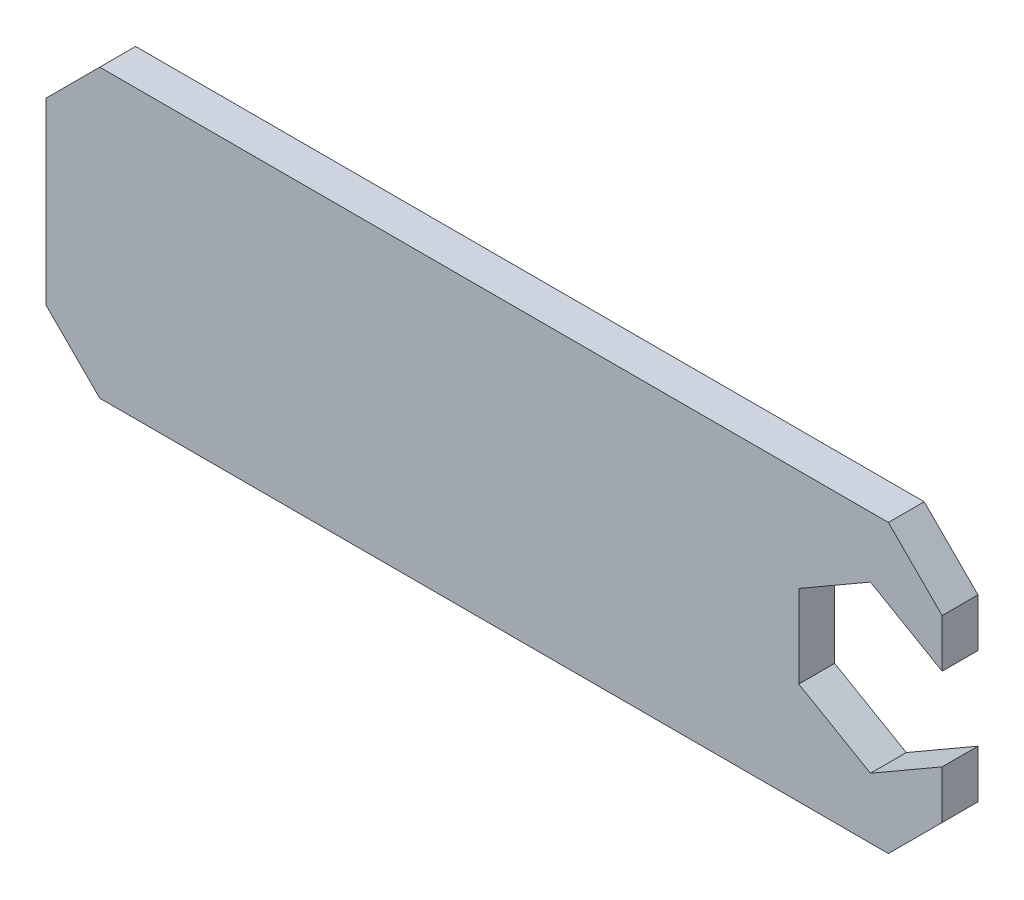
ISO-10303-21;
HEADER;
FILE_DESCRIPTION(('STEP AP214'),'2;1');
FILE_NAME('part.step','',(''),(''),'','','');
FILE_SCHEMA(('AUTOMOTIVE_DESIGN { 1 0 10303 214 1 1 1 1 }'));
ENDSEC;
DATA;
#1=APPLICATION_CONTEXT('core data for automotive mechanical design processes');
#2=APPLICATION_PROTOCOL_DEFINITION('international standard','automotive_design',2000,#1);
#3=PRODUCT_CONTEXT('',#1,'mechanical');
#4=PRODUCT('Part','Part','',(#3));
#5=PRODUCT_RELATED_PRODUCT_CATEGORY('part','',(#4));
#6=PRODUCT_DEFINITION_FORMATION('','',#4);
#7=PRODUCT_DEFINITION_CONTEXT('part definition',#1,'design');
#8=PRODUCT_DEFINITION('design','',#6,#7);
#9=PRODUCT_DEFINITION_SHAPE('','',#8);
#10=(LENGTH_UNIT() NAMED_UNIT(*) SI_UNIT(.MILLI.,.METRE.));
#11=(NAMED_UNIT(*) PLANE_ANGLE_UNIT() SI_UNIT($,.RADIAN.));
#12=(NAMED_UNIT(*) SI_UNIT($,.STERADIAN.) SOLID_ANGLE_UNIT());
#13=UNCERTAINTY_MEASURE_WITH_UNIT(LENGTH_MEASURE(1.E-05),#10,'distance_accuracy_value','');
#14=(GEOMETRIC_REPRESENTATION_CONTEXT(3) GLOBAL_UNCERTAINTY_ASSIGNED_CONTEXT((#13)) GLOBAL_UNIT_ASSIGNED_CONTEXT((#10,
#11,#12)) REPRESENTATION_CONTEXT('',''));
#15=CARTESIAN_POINT('',(0.,0.,0.));
#16=DIRECTION('',(0.,0.,1.));
#17=DIRECTION('',(1.,0.,0.));
#18=AXIS2_PLACEMENT_3D('',#15,#16,#17);
#19=CARTESIAN_POINT('',(50.,0.,2.));
#20=DIRECTION('',(-1.,0.,0.));
#21=DIRECTION('',(0.,0.,1.));
#22=AXIS2_PLACEMENT_3D('',#19,#20,#21);
#23=PLANE('',#22);
#24=DIRECTION('',(0.,1.,0.));
#25=VECTOR('',#24,1.);
#26=CARTESIAN_POINT('',(50.,0.,2.));
#27=LINE('',#26,#25);
#28=CARTESIAN_POINT('',(50.,10.3094010767585,2.));
#29=VERTEX_POINT('',#28);
#30=CARTESIAN_POINT('',(50.,13.,2.));
#31=VERTEX_POINT('',#30);
#32=EDGE_CURVE('E104',#29,#31,#27,.T.);
#33=ORIENTED_EDGE('',*,*,#32,.F.);
#34=DIRECTION('',(0.,0.,1.));
#35=VECTOR('',#34,1.);
#36=CARTESIAN_POINT('',(50.,10.3094010767585,-8.));
#37=LINE('',#36,#35);
#38=CARTESIAN_POINT('',(50.,10.3094010767585,0.));
#39=VERTEX_POINT('',#38);
#40=EDGE_CURVE('E231',#39,#29,#37,.T.);
#41=ORIENTED_EDGE('',*,*,#40,.F.);
#42=DIRECTION('',(0.,1.,0.));
#43=VECTOR('',#42,1.);
#44=CARTESIAN_POINT('',(50.,0.,0.));
#45=LINE('',#44,#43);
#46=CARTESIAN_POINT('',(50.,13.,0.));
#47=VERTEX_POINT('',#46);
#48=EDGE_CURVE('E152',#39,#47,#45,.T.);
#49=ORIENTED_EDGE('',*,*,#48,.T.);
#50=DIRECTION('',(0.,0.,-1.));
#51=VECTOR('',#50,1.);
#52=CARTESIAN_POINT('',(50.,13.,2.));
#53=LINE('',#52,#51);
#54=EDGE_CURVE('E177',#31,#47,#53,.T.);
#55=ORIENTED_EDGE('',*,*,#54,.F.);
#56=EDGE_LOOP('',(#33,#41,#49,#55));
#57=FACE_BOUND('',#56,.T.);
#58=ADVANCED_FACE('F39',(#57),#23,.F.);
#59=CARTESIAN_POINT('',(50.,3.00000000000001,0.));
#60=VERTEX_POINT('',#59);
#61=CARTESIAN_POINT('',(50.,5.6905989232415,0.));
#62=VERTEX_POINT('',#61);
#63=EDGE_CURVE('E148',#60,#62,#45,.T.);
#64=ORIENTED_EDGE('',*,*,#63,.T.);
#65=DIRECTION('',(0.,0.,1.));
#66=VECTOR('',#65,1.);
#67=CARTESIAN_POINT('',(50.,5.6905989232415,-8.));
#68=LINE('',#67,#66);
#69=CARTESIAN_POINT('',(50.,5.6905989232415,2.));
#70=VERTEX_POINT('',#69);
#71=EDGE_CURVE('E205',#62,#70,#68,.T.);
#72=ORIENTED_EDGE('',*,*,#71,.T.);
#73=CARTESIAN_POINT('',(50.,3.00000000000001,2.));
#74=VERTEX_POINT('',#73);
#75=EDGE_CURVE('E206',#74,#70,#27,.T.);
#76=ORIENTED_EDGE('',*,*,#75,.F.);
#77=DIRECTION('',(0.,0.,-1.));
#78=VECTOR('',#77,1.);
#79=CARTESIAN_POINT('',(50.,3.00000000000001,2.));
#80=LINE('',#79,#78);
#81=EDGE_CURVE('E144',#74,#60,#80,.T.);
#82=ORIENTED_EDGE('',*,*,#81,.T.);
#83=EDGE_LOOP('',(#64,#72,#76,#82));
#84=FACE_BOUND('',#83,.T.);
#85=ADVANCED_FACE('F41',(#84),#23,.F.);
#86=CARTESIAN_POINT('',(31.5,31.5,2.));
#87=DIRECTION('',(-0.707106781186547,-0.707106781186548,0.));
#88=DIRECTION('',(0.707106781186548,-0.707106781186547,0.));
#89=AXIS2_PLACEMENT_3D('',#86,#87,#88);
#90=PLANE('',#89);
#91=DIRECTION('',(-0.707106781186548,0.707106781186547,0.));
#92=VECTOR('',#91,1.);
#93=CARTESIAN_POINT('',(31.5,31.5,0.));
#94=LINE('',#93,#92);
#95=CARTESIAN_POINT('',(47.,16.,0.));
#96=VERTEX_POINT('',#95);
#97=EDGE_CURVE('E151',#47,#96,#94,.T.);
#98=ORIENTED_EDGE('',*,*,#97,.T.);
#99=DIRECTION('',(0.,0.,-1.));
#100=VECTOR('',#99,1.);
#101=CARTESIAN_POINT('',(47.,16.,2.));
#102=LINE('',#101,#100);
#103=CARTESIAN_POINT('',(47.,16.,2.));
#104=VERTEX_POINT('',#103);
#105=EDGE_CURVE('E175',#104,#96,#102,.T.);
#106=ORIENTED_EDGE('',*,*,#105,.F.);
#107=DIRECTION('',(-0.707106781186548,0.707106781186547,0.));
#108=VECTOR('',#107,1.);
#109=CARTESIAN_POINT('',(31.5,31.5,2.));
#110=LINE('',#109,#108);
#111=EDGE_CURVE('E226',#31,#104,#110,.T.);
#112=ORIENTED_EDGE('',*,*,#111,.F.);
#113=ORIENTED_EDGE('',*,*,#54,.T.);
#114=EDGE_LOOP('',(#98,#106,#112,#113));
#115=FACE_BOUND('',#114,.T.);
#116=ADVANCED_FACE('F224',(#115),#90,.F.);
#117=CARTESIAN_POINT('',(0.,16.,2.));
#118=DIRECTION('',(0.,1.,0.));
#119=DIRECTION('',(0.,0.,1.));
#120=AXIS2_PLACEMENT_3D('',#117,#118,#119);
#121=PLANE('',#120);
#122=DIRECTION('',(1.,0.,0.));
#123=VECTOR('',#122,1.);
#124=CARTESIAN_POINT('',(0.,16.,0.));
#125=LINE('',#124,#123);
#126=CARTESIAN_POINT('',(3.,16.,0.));
#127=VERTEX_POINT('',#126);
#128=EDGE_CURVE('E155',#127,#96,#125,.T.);
#129=ORIENTED_EDGE('',*,*,#128,.F.);
#130=DIRECTION('',(0.,0.,-1.));
#131=VECTOR('',#130,1.);
#132=CARTESIAN_POINT('',(3.,16.,2.));
#133=LINE('',#132,#131);
#134=CARTESIAN_POINT('',(3.,16.,2.));
#135=VERTEX_POINT('',#134);
#136=EDGE_CURVE('E173',#135,#127,#133,.T.);
#137=ORIENTED_EDGE('',*,*,#136,.F.);
#138=DIRECTION('',(1.,0.,0.));
#139=VECTOR('',#138,1.);
#140=CARTESIAN_POINT('',(0.,16.,2.));
#141=LINE('',#140,#139);
#142=EDGE_CURVE('E222',#135,#104,#141,.T.);
#143=ORIENTED_EDGE('',*,*,#142,.T.);
#144=ORIENTED_EDGE('',*,*,#105,.T.);
#145=EDGE_LOOP('',(#129,#137,#143,#144));
#146=FACE_BOUND('',#145,.T.);
#147=ADVANCED_FACE('F218',(#146),#121,.T.);
#148=CARTESIAN_POINT('',(-6.5,6.5,2.));
#149=DIRECTION('',(-0.707106781186547,0.707106781186548,0.));
#150=DIRECTION('',(-0.707106781186548,-0.707106781186547,0.));
#151=AXIS2_PLACEMENT_3D('',#148,#149,#150);
#152=PLANE('',#151);
#153=DIRECTION('',(0.707106781186548,0.707106781186547,0.));
#154=VECTOR('',#153,1.);
#155=CARTESIAN_POINT('',(-6.5,6.5,0.));
#156=LINE('',#155,#154);
#157=CARTESIAN_POINT('',(0.,13.,0.));
#158=VERTEX_POINT('',#157);
#159=EDGE_CURVE('E158',#158,#127,#156,.T.);
#160=ORIENTED_EDGE('',*,*,#159,.F.);
#161=DIRECTION('',(0.,0.,-1.));
#162=VECTOR('',#161,1.);
#163=CARTESIAN_POINT('',(0.,13.,2.));
#164=LINE('',#163,#162);
#165=CARTESIAN_POINT('',(0.,13.,2.));
#166=VERTEX_POINT('',#165);
#167=EDGE_CURVE('E171',#166,#158,#164,.T.);
#168=ORIENTED_EDGE('',*,*,#167,.F.);
#169=DIRECTION('',(0.707106781186548,0.707106781186547,0.));
#170=VECTOR('',#169,1.);
#171=CARTESIAN_POINT('',(-6.5,6.5,2.));
#172=LINE('',#171,#170);
#173=EDGE_CURVE('E253',#166,#135,#172,.T.);
#174=ORIENTED_EDGE('',*,*,#173,.T.);
#175=ORIENTED_EDGE('',*,*,#136,.T.);
#176=EDGE_LOOP('',(#160,#168,#174,#175));
#177=FACE_BOUND('',#176,.T.);
#178=ADVANCED_FACE('F214',(#177),#152,.T.);
#179=CARTESIAN_POINT('',(0.,0.,2.));
#180=DIRECTION('',(-1.,0.,0.));
#181=DIRECTION('',(0.,0.,1.));
#182=AXIS2_PLACEMENT_3D('',#179,#180,#181);
#183=PLANE('',#182);
#184=DIRECTION('',(0.,1.,0.));
#185=VECTOR('',#184,1.);
#186=CARTESIAN_POINT('',(0.,0.,0.));
#187=LINE('',#186,#185);
#188=CARTESIAN_POINT('',(0.,3.,0.));
#189=VERTEX_POINT('',#188);
#190=EDGE_CURVE('E161',#189,#158,#187,.T.);
#191=ORIENTED_EDGE('',*,*,#190,.F.);
#192=DIRECTION('',(0.,0.,-1.));
#193=VECTOR('',#192,1.);
#194=CARTESIAN_POINT('',(0.,3.,2.));
#195=LINE('',#194,#193);
#196=CARTESIAN_POINT('',(0.,3.,2.));
#197=VERTEX_POINT('',#196);
#198=EDGE_CURVE('E139',#197,#189,#195,.T.);
#199=ORIENTED_EDGE('',*,*,#198,.F.);
#200=DIRECTION('',(0.,1.,0.));
#201=VECTOR('',#200,1.);
#202=CARTESIAN_POINT('',(0.,0.,2.));
#203=LINE('',#202,#201);
#204=EDGE_CURVE('E129',#197,#166,#203,.T.);
#205=ORIENTED_EDGE('',*,*,#204,.T.);
#206=ORIENTED_EDGE('',*,*,#167,.T.);
#207=EDGE_LOOP('',(#191,#199,#205,#206));
#208=FACE_BOUND('',#207,.T.);
#209=ADVANCED_FACE('F210',(#208),#183,.T.);
#210=CARTESIAN_POINT('',(1.5,1.5,2.));
#211=DIRECTION('',(0.707106781186547,0.707106781186547,0.));
#212=DIRECTION('',(-0.707106781186548,0.707106781186548,0.));
#213=AXIS2_PLACEMENT_3D('',#210,#211,#212);
#214=PLANE('',#213);
#215=DIRECTION('',(0.707106781186548,-0.707106781186548,0.));
#216=VECTOR('',#215,1.);
#217=CARTESIAN_POINT('',(1.5,1.5,0.));
#218=LINE('',#217,#216);
#219=CARTESIAN_POINT('',(3.,0.,0.));
#220=VERTEX_POINT('',#219);
#221=EDGE_CURVE('E136',#189,#220,#218,.T.);
#222=ORIENTED_EDGE('',*,*,#221,.T.);
#223=DIRECTION('',(0.,0.,-1.));
#224=VECTOR('',#223,1.);
#225=CARTESIAN_POINT('',(3.,0.,2.));
#226=LINE('',#225,#224);
#227=CARTESIAN_POINT('',(3.,0.,2.));
#228=VERTEX_POINT('',#227);
#229=EDGE_CURVE('E133',#228,#220,#226,.T.);
#230=ORIENTED_EDGE('',*,*,#229,.F.);
#231=DIRECTION('',(0.707106781186548,-0.707106781186548,0.));
#232=VECTOR('',#231,1.);
#233=CARTESIAN_POINT('',(1.5,1.5,2.));
#234=LINE('',#233,#232);
#235=EDGE_CURVE('E121',#197,#228,#234,.T.);
#236=ORIENTED_EDGE('',*,*,#235,.F.);
#237=ORIENTED_EDGE('',*,*,#198,.T.);
#238=EDGE_LOOP('',(#222,#230,#236,#237));
#239=FACE_BOUND('',#238,.T.);
#240=ADVANCED_FACE('F134',(#239),#214,.F.);
#241=CARTESIAN_POINT('',(0.,0.,2.));
#242=DIRECTION('',(0.,1.,0.));
#243=DIRECTION('',(0.,0.,1.));
#244=AXIS2_PLACEMENT_3D('',#241,#242,#243);
#245=PLANE('',#244);
#246=DIRECTION('',(1.,0.,0.));
#247=VECTOR('',#246,1.);
#248=CARTESIAN_POINT('',(0.,0.,0.));
#249=LINE('',#248,#247);
#250=CARTESIAN_POINT('',(47.,0.,0.));
#251=VERTEX_POINT('',#250);
#252=EDGE_CURVE('E165',#220,#251,#249,.T.);
#253=ORIENTED_EDGE('',*,*,#252,.T.);
#254=DIRECTION('',(0.,0.,-1.));
#255=VECTOR('',#254,1.);
#256=CARTESIAN_POINT('',(47.,0.,2.));
#257=LINE('',#256,#255);
#258=CARTESIAN_POINT('',(47.,0.,2.));
#259=VERTEX_POINT('',#258);
#260=EDGE_CURVE('E140',#259,#251,#257,.T.);
#261=ORIENTED_EDGE('',*,*,#260,.F.);
#262=DIRECTION('',(1.,0.,0.));
#263=VECTOR('',#262,1.);
#264=CARTESIAN_POINT('',(0.,0.,2.));
#265=LINE('',#264,#263);
#266=EDGE_CURVE('E125',#228,#259,#265,.T.);
#267=ORIENTED_EDGE('',*,*,#266,.F.);
#268=ORIENTED_EDGE('',*,*,#229,.T.);
#269=EDGE_LOOP('',(#253,#261,#267,#268));
#270=FACE_BOUND('',#269,.T.);
#271=ADVANCED_FACE('F142',(#270),#245,.F.);
#272=CARTESIAN_POINT('',(23.5,-23.5,2.));
#273=DIRECTION('',(-0.707106781186547,0.707106781186548,0.));
#274=DIRECTION('',(-0.707106781186548,-0.707106781186547,0.));
#275=AXIS2_PLACEMENT_3D('',#272,#273,#274);
#276=PLANE('',#275);
#277=DIRECTION('',(0.707106781186548,0.707106781186547,0.));
#278=VECTOR('',#277,1.);
#279=CARTESIAN_POINT('',(23.5,-23.5,0.));
#280=LINE('',#279,#278);
#281=EDGE_CURVE('E96',#251,#60,#280,.T.);
#282=ORIENTED_EDGE('',*,*,#281,.T.);
#283=ORIENTED_EDGE('',*,*,#81,.F.);
#284=DIRECTION('',(0.707106781186548,0.707106781186547,0.));
#285=VECTOR('',#284,1.);
#286=CARTESIAN_POINT('',(23.5,-23.5,2.));
#287=LINE('',#286,#285);
#288=EDGE_CURVE('E63',#259,#74,#287,.T.);
#289=ORIENTED_EDGE('',*,*,#288,.F.);
#290=ORIENTED_EDGE('',*,*,#260,.T.);
#291=EDGE_LOOP('',(#282,#283,#289,#290));
#292=FACE_BOUND('',#291,.T.);
#293=ADVANCED_FACE('F207',(#292),#276,.F.);
#294=CARTESIAN_POINT('',(0.,0.,2.));
#295=DIRECTION('',(0.,0.,1.));
#296=DIRECTION('',(1.,0.,0.));
#297=AXIS2_PLACEMENT_3D('',#294,#295,#296);
#298=PLANE('',#297);
#299=DIRECTION('',(-0.866025403784438,0.500000000000001,0.));
#300=VECTOR('',#299,1.);
#301=CARTESIAN_POINT('',(50.,10.3094010767585,2.));
#302=LINE('',#301,#300);
#303=CARTESIAN_POINT('',(46.,12.618802153517,2.));
#304=VERTEX_POINT('',#303);
#305=EDGE_CURVE('E281',#29,#304,#302,.T.);
#306=ORIENTED_EDGE('',*,*,#305,.F.);
#307=ORIENTED_EDGE('',*,*,#32,.T.);
#308=ORIENTED_EDGE('',*,*,#111,.T.);
#309=ORIENTED_EDGE('',*,*,#142,.F.);
#310=ORIENTED_EDGE('',*,*,#173,.F.);
#311=ORIENTED_EDGE('',*,*,#204,.F.);
#312=ORIENTED_EDGE('',*,*,#235,.T.);
#313=ORIENTED_EDGE('',*,*,#266,.T.);
#314=ORIENTED_EDGE('',*,*,#288,.T.);
#315=ORIENTED_EDGE('',*,*,#75,.T.);
#316=DIRECTION('',(0.866025403784438,0.500000000000001,0.));
#317=VECTOR('',#316,1.);
#318=CARTESIAN_POINT('',(46.,3.381197846483,2.));
#319=LINE('',#318,#317);
#320=CARTESIAN_POINT('',(46.,3.381197846483,2.));
#321=VERTEX_POINT('',#320);
#322=EDGE_CURVE('E239',#321,#70,#319,.T.);
#323=ORIENTED_EDGE('',*,*,#322,.F.);
#324=DIRECTION('',(0.866025403784439,-0.499999999999999,0.));
#325=VECTOR('',#324,1.);
#326=CARTESIAN_POINT('',(42.,5.6905989232415,2.));
#327=LINE('',#326,#325);
#328=CARTESIAN_POINT('',(42.,5.6905989232415,2.));
#329=VERTEX_POINT('',#328);
#330=EDGE_CURVE('E288',#329,#321,#327,.T.);
#331=ORIENTED_EDGE('',*,*,#330,.F.);
#332=DIRECTION('',(0.,-1.,0.));
#333=VECTOR('',#332,1.);
#334=CARTESIAN_POINT('',(42.,10.3094010767585,2.));
#335=LINE('',#334,#333);
#336=CARTESIAN_POINT('',(42.,10.3094010767585,2.));
#337=VERTEX_POINT('',#336);
#338=EDGE_CURVE('E276',#337,#329,#335,.T.);
#339=ORIENTED_EDGE('',*,*,#338,.F.);
#340=DIRECTION('',(-0.866025403784439,-0.5,0.));
#341=VECTOR('',#340,1.);
#342=CARTESIAN_POINT('',(46.,12.618802153517,2.));
#343=LINE('',#342,#341);
#344=EDGE_CURVE('E285',#304,#337,#343,.T.);
#345=ORIENTED_EDGE('',*,*,#344,.F.);
#346=EDGE_LOOP('',(#306,#307,#308,#309,#310,#311,#312,#313,#314,#315,#323,#331,#339,#345));
#347=FACE_BOUND('',#346,.T.);
#348=ADVANCED_FACE('F123',(#347),#298,.T.);
#349=CARTESIAN_POINT('',(0.,0.,0.));
#350=DIRECTION('',(0.,0.,1.));
#351=DIRECTION('',(1.,0.,0.));
#352=AXIS2_PLACEMENT_3D('',#349,#350,#351);
#353=PLANE('',#352);
#354=ORIENTED_EDGE('',*,*,#48,.F.);
#355=DIRECTION('',(-0.866025403784438,0.500000000000001,0.));
#356=VECTOR('',#355,1.);
#357=CARTESIAN_POINT('',(16.9641016151378,29.3826859021799,0.));
#358=LINE('',#357,#356);
#359=CARTESIAN_POINT('',(46.,12.618802153517,0.));
#360=VERTEX_POINT('',#359);
#361=EDGE_CURVE('E11',#39,#360,#358,.T.);
#362=ORIENTED_EDGE('',*,*,#361,.T.);
#363=DIRECTION('',(-0.866025403784439,-0.5,0.));
#364=VECTOR('',#363,1.);
#365=CARTESIAN_POINT('',(6.03589838486225,-10.4544826719043,0.));
#366=LINE('',#365,#364);
#367=CARTESIAN_POINT('',(42.,10.3094010767585,0.));
#368=VERTEX_POINT('',#367);
#369=EDGE_CURVE('E180',#360,#368,#366,.T.);
#370=ORIENTED_EDGE('',*,*,#369,.T.);
#371=DIRECTION('',(0.,-1.,0.));
#372=VECTOR('',#371,1.);
#373=CARTESIAN_POINT('',(42.,0.,0.));
#374=LINE('',#373,#372);
#375=CARTESIAN_POINT('',(42.,5.6905989232415,0.));
#376=VERTEX_POINT('',#375);
#377=EDGE_CURVE('E183',#368,#376,#374,.T.);
#378=ORIENTED_EDGE('',*,*,#377,.T.);
#379=DIRECTION('',(0.866025403784439,-0.499999999999999,0.));
#380=VECTOR('',#379,1.);
#381=CARTESIAN_POINT('',(12.9641016151377,22.4544826719043,0.));
#382=LINE('',#381,#380);
#383=CARTESIAN_POINT('',(46.,3.381197846483,0.));
#384=VERTEX_POINT('',#383);
#385=EDGE_CURVE('E186',#376,#384,#382,.T.);
#386=ORIENTED_EDGE('',*,*,#385,.T.);
#387=DIRECTION('',(0.866025403784438,0.500000000000001,0.));
#388=VECTOR('',#387,1.);
#389=CARTESIAN_POINT('',(10.0358983848623,-17.3826859021799,0.));
#390=LINE('',#389,#388);
#391=EDGE_CURVE('E47',#384,#62,#390,.T.);
#392=ORIENTED_EDGE('',*,*,#391,.T.);
#393=ORIENTED_EDGE('',*,*,#63,.F.);
#394=ORIENTED_EDGE('',*,*,#281,.F.);
#395=ORIENTED_EDGE('',*,*,#252,.F.);
#396=ORIENTED_EDGE('',*,*,#221,.F.);
#397=ORIENTED_EDGE('',*,*,#190,.T.);
#398=ORIENTED_EDGE('',*,*,#159,.T.);
#399=ORIENTED_EDGE('',*,*,#128,.T.);
#400=ORIENTED_EDGE('',*,*,#97,.F.);
#401=EDGE_LOOP('',(#354,#362,#370,#378,#386,#392,#393,#394,#395,#396,#397,#398,#399,#400));
#402=FACE_BOUND('',#401,.T.);
#403=ADVANCED_FACE('F194',(#402),#353,.F.);
#404=CARTESIAN_POINT('',(50.,10.3094010767585,-8.));
#405=DIRECTION('',(0.500000000000001,0.866025403784438,0.));
#406=DIRECTION('',(-0.866025403784438,0.500000000000001,0.));
#407=AXIS2_PLACEMENT_3D('',#404,#405,#406);
#408=PLANE('',#407);
#409=ORIENTED_EDGE('',*,*,#40,.T.);
#410=ORIENTED_EDGE('',*,*,#305,.T.);
#411=DIRECTION('',(0.,0.,1.));
#412=VECTOR('',#411,1.);
#413=CARTESIAN_POINT('',(46.,12.618802153517,-8.));
#414=LINE('',#413,#412);
#415=EDGE_CURVE('E247',#360,#304,#414,.T.);
#416=ORIENTED_EDGE('',*,*,#415,.F.);
#417=ORIENTED_EDGE('',*,*,#361,.F.);
#418=EDGE_LOOP('',(#409,#410,#416,#417));
#419=FACE_BOUND('',#418,.T.);
#420=ADVANCED_FACE('F280',(#419),#408,.F.);
#421=CARTESIAN_POINT('',(46.,3.381197846483,-8.));
#422=DIRECTION('',(0.500000000000001,-0.866025403784438,0.));
#423=DIRECTION('',(0.866025403784438,0.500000000000001,0.));
#424=AXIS2_PLACEMENT_3D('',#421,#422,#423);
#425=PLANE('',#424);
#426=DIRECTION('',(0.,0.,1.));
#427=VECTOR('',#426,1.);
#428=CARTESIAN_POINT('',(46.,3.381197846483,-8.));
#429=LINE('',#428,#427);
#430=EDGE_CURVE('E236',#384,#321,#429,.T.);
#431=ORIENTED_EDGE('',*,*,#430,.T.);
#432=ORIENTED_EDGE('',*,*,#322,.T.);
#433=ORIENTED_EDGE('',*,*,#71,.F.);
#434=ORIENTED_EDGE('',*,*,#391,.F.);
#435=EDGE_LOOP('',(#431,#432,#433,#434));
#436=FACE_BOUND('',#435,.T.);
#437=ADVANCED_FACE('F292',(#436),#425,.F.);
#438=CARTESIAN_POINT('',(42.,5.6905989232415,-8.));
#439=DIRECTION('',(-0.499999999999999,-0.866025403784439,0.));
#440=DIRECTION('',(0.866025403784439,-0.499999999999999,0.));
#441=AXIS2_PLACEMENT_3D('',#438,#439,#440);
#442=PLANE('',#441);
#443=DIRECTION('',(0.,0.,1.));
#444=VECTOR('',#443,1.);
#445=CARTESIAN_POINT('',(42.,5.6905989232415,-8.));
#446=LINE('',#445,#444);
#447=EDGE_CURVE('E243',#376,#329,#446,.T.);
#448=ORIENTED_EDGE('',*,*,#447,.T.);
#449=ORIENTED_EDGE('',*,*,#330,.T.);
#450=ORIENTED_EDGE('',*,*,#430,.F.);
#451=ORIENTED_EDGE('',*,*,#385,.F.);
#452=EDGE_LOOP('',(#448,#449,#450,#451));
#453=FACE_BOUND('',#452,.T.);
#454=ADVANCED_FACE('F270',(#453),#442,.F.);
#455=CARTESIAN_POINT('',(42.,10.3094010767585,-8.));
#456=DIRECTION('',(-1.,0.,0.));
#457=DIRECTION('',(0.,0.,1.));
#458=AXIS2_PLACEMENT_3D('',#455,#456,#457);
#459=PLANE('',#458);
#460=DIRECTION('',(0.,0.,1.));
#461=VECTOR('',#460,1.);
#462=CARTESIAN_POINT('',(42.,10.3094010767585,-8.));
#463=LINE('',#462,#461);
#464=EDGE_CURVE('E54',#368,#337,#463,.T.);
#465=ORIENTED_EDGE('',*,*,#464,.T.);
#466=ORIENTED_EDGE('',*,*,#338,.T.);
#467=ORIENTED_EDGE('',*,*,#447,.F.);
#468=ORIENTED_EDGE('',*,*,#377,.F.);
#469=EDGE_LOOP('',(#465,#466,#467,#468));
#470=FACE_BOUND('',#469,.T.);
#471=ADVANCED_FACE('F274',(#470),#459,.F.);
#472=CARTESIAN_POINT('',(46.,12.618802153517,-8.));
#473=DIRECTION('',(-0.5,0.866025403784439,0.));
#474=DIRECTION('',(-0.866025403784439,-0.5,0.));
#475=AXIS2_PLACEMENT_3D('',#472,#473,#474);
#476=PLANE('',#475);
#477=ORIENTED_EDGE('',*,*,#415,.T.);
#478=ORIENTED_EDGE('',*,*,#344,.T.);
#479=ORIENTED_EDGE('',*,*,#464,.F.);
#480=ORIENTED_EDGE('',*,*,#369,.F.);
#481=EDGE_LOOP('',(#477,#478,#479,#480));
#482=FACE_BOUND('',#481,.T.);
#483=ADVANCED_FACE('F278',(#482),#476,.F.);
#484=CLOSED_SHELL('',(#58,#85,#116,#147,#178,#209,#240,#271,#293,#348,#403,#420,#437,#454,#471,#483));
#485=MANIFOLD_SOLID_BREP('B2',#484);
#486=ADVANCED_BREP_SHAPE_REPRESENTATION('',(#18,#485),#14);
#487=SHAPE_DEFINITION_REPRESENTATION(#9,#486);
ENDSEC;
END-ISO-10303-21;
